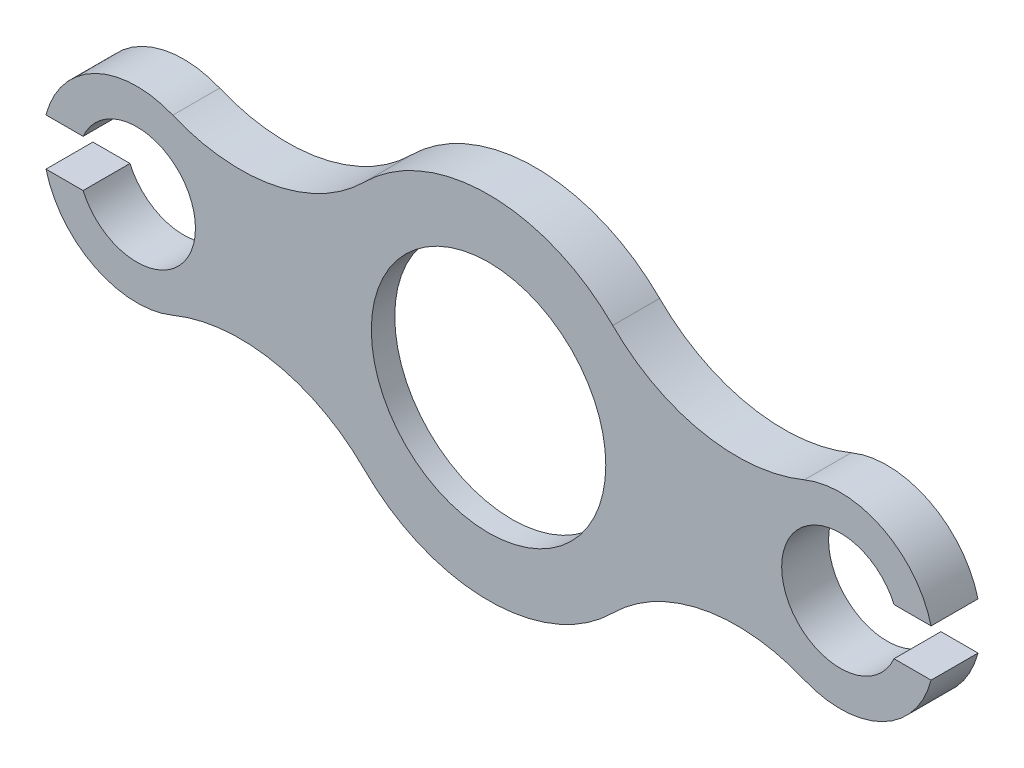
ISO-10303-21;
HEADER;
FILE_DESCRIPTION(('STEP AP214'),'2;1');
FILE_NAME('part.step','',(''),(''),'','','');
FILE_SCHEMA(('AUTOMOTIVE_DESIGN { 1 0 10303 214 1 1 1 1 }'));
ENDSEC;
DATA;
#1=APPLICATION_CONTEXT('core data for automotive mechanical design processes');
#2=APPLICATION_PROTOCOL_DEFINITION('international standard','automotive_design',2000,#1);
#3=PRODUCT_CONTEXT('',#1,'mechanical');
#4=PRODUCT('Part','Part','',(#3));
#5=PRODUCT_RELATED_PRODUCT_CATEGORY('part','',(#4));
#6=PRODUCT_DEFINITION_FORMATION('','',#4);
#7=PRODUCT_DEFINITION_CONTEXT('part definition',#1,'design');
#8=PRODUCT_DEFINITION('design','',#6,#7);
#9=PRODUCT_DEFINITION_SHAPE('','',#8);
#10=(LENGTH_UNIT() NAMED_UNIT(*) SI_UNIT(.MILLI.,.METRE.));
#11=(NAMED_UNIT(*) PLANE_ANGLE_UNIT() SI_UNIT($,.RADIAN.));
#12=(NAMED_UNIT(*) SI_UNIT($,.STERADIAN.) SOLID_ANGLE_UNIT());
#13=UNCERTAINTY_MEASURE_WITH_UNIT(LENGTH_MEASURE(1.E-05),#10,'distance_accuracy_value','');
#14=(GEOMETRIC_REPRESENTATION_CONTEXT(3) GLOBAL_UNCERTAINTY_ASSIGNED_CONTEXT((#13)) GLOBAL_UNIT_ASSIGNED_CONTEXT((#10,
#11,#12)) REPRESENTATION_CONTEXT('',''));
#15=CARTESIAN_POINT('',(0.,0.,0.));
#16=DIRECTION('',(0.,0.,1.));
#17=DIRECTION('',(1.,0.,0.));
#18=AXIS2_PLACEMENT_3D('',#15,#16,#17);
#19=CARTESIAN_POINT('',(-105.916666666667,-106.215157685814,20.));
#20=DIRECTION('',(0.,0.,-1.));
#21=DIRECTION('',(-1.,0.,0.));
#22=AXIS2_PLACEMENT_3D('',#19,#20,#21);
#23=CYLINDRICAL_SURFACE('',#22,75.);
#24=CARTESIAN_POINT('',(-105.916666666667,-106.215157685814,0.));
#25=DIRECTION('',(0.,0.,1.));
#26=DIRECTION('',(1.,0.,0.));
#27=AXIS2_PLACEMENT_3D('',#24,#25,#26);
#28=CIRCLE('',#27,75.);
#29=CARTESIAN_POINT('',(-52.9583333333333,-53.1075788429067,0.));
#30=VERTEX_POINT('',#29);
#31=CARTESIAN_POINT('',(-134.666666666667,-36.9444026733265,0.));
#32=VERTEX_POINT('',#31);
#33=EDGE_CURVE('E181',#30,#32,#28,.T.);
#34=ORIENTED_EDGE('',*,*,#33,.F.);
#35=DIRECTION('',(0.,0.,-1.));
#36=VECTOR('',#35,1.);
#37=CARTESIAN_POINT('',(-52.9583333333333,-53.1075788429067,20.));
#38=LINE('',#37,#36);
#39=CARTESIAN_POINT('',(-52.9583333333333,-53.1075788429067,20.));
#40=VERTEX_POINT('',#39);
#41=EDGE_CURVE('E11',#40,#30,#38,.T.);
#42=ORIENTED_EDGE('',*,*,#41,.F.);
#43=CARTESIAN_POINT('',(-105.916666666667,-106.215157685814,20.));
#44=DIRECTION('',(0.,0.,1.));
#45=DIRECTION('',(1.,0.,0.));
#46=AXIS2_PLACEMENT_3D('',#43,#44,#45);
#47=CIRCLE('',#46,75.);
#48=CARTESIAN_POINT('',(-134.666666666667,-36.9444026733265,20.));
#49=VERTEX_POINT('',#48);
#50=EDGE_CURVE('E318',#40,#49,#47,.T.);
#51=ORIENTED_EDGE('',*,*,#50,.T.);
#52=DIRECTION('',(0.,0.,-1.));
#53=VECTOR('',#52,1.);
#54=CARTESIAN_POINT('',(-134.666666666667,-36.9444026733265,20.));
#55=LINE('',#54,#53);
#56=EDGE_CURVE('E53',#49,#32,#55,.T.);
#57=ORIENTED_EDGE('',*,*,#56,.T.);
#58=EDGE_LOOP('',(#34,#42,#51,#57));
#59=FACE_BOUND('',#58,.T.);
#60=ADVANCED_FACE('F37',(#59),#23,.F.);
#61=CARTESIAN_POINT('',(0.,0.,20.));
#62=DIRECTION('',(0.,0.,-1.));
#63=DIRECTION('',(-1.,0.,0.));
#64=AXIS2_PLACEMENT_3D('',#61,#62,#63);
#65=CYLINDRICAL_SURFACE('',#64,75.);
#66=CARTESIAN_POINT('',(0.,0.,0.));
#67=DIRECTION('',(0.,0.,1.));
#68=DIRECTION('',(1.,0.,0.));
#69=AXIS2_PLACEMENT_3D('',#66,#67,#68);
#70=CIRCLE('',#69,75.);
#71=CARTESIAN_POINT('',(52.9583333333333,-53.1075788429067,0.));
#72=VERTEX_POINT('',#71);
#73=EDGE_CURVE('E183',#30,#72,#70,.T.);
#74=ORIENTED_EDGE('',*,*,#73,.T.);
#75=DIRECTION('',(0.,0.,-1.));
#76=VECTOR('',#75,1.);
#77=CARTESIAN_POINT('',(52.9583333333333,-53.1075788429067,20.));
#78=LINE('',#77,#76);
#79=CARTESIAN_POINT('',(52.9583333333333,-53.1075788429067,20.));
#80=VERTEX_POINT('',#79);
#81=EDGE_CURVE('E45',#80,#72,#78,.T.);
#82=ORIENTED_EDGE('',*,*,#81,.F.);
#83=CARTESIAN_POINT('',(0.,0.,20.));
#84=DIRECTION('',(0.,0.,1.));
#85=DIRECTION('',(1.,0.,0.));
#86=AXIS2_PLACEMENT_3D('',#83,#84,#85);
#87=CIRCLE('',#86,75.);
#88=EDGE_CURVE('E268',#40,#80,#87,.T.);
#89=ORIENTED_EDGE('',*,*,#88,.F.);
#90=ORIENTED_EDGE('',*,*,#41,.T.);
#91=EDGE_LOOP('',(#74,#82,#89,#90));
#92=FACE_BOUND('',#91,.T.);
#93=ADVANCED_FACE('F313',(#92),#65,.T.);
#94=CARTESIAN_POINT('',(105.916666666667,-106.215157685813,20.));
#95=DIRECTION('',(0.,0.,-1.));
#96=DIRECTION('',(-1.,0.,0.));
#97=AXIS2_PLACEMENT_3D('',#94,#95,#96);
#98=CYLINDRICAL_SURFACE('',#97,75.);
#99=CARTESIAN_POINT('',(105.916666666667,-106.215157685813,0.));
#100=DIRECTION('',(0.,0.,1.));
#101=DIRECTION('',(1.,0.,0.));
#102=AXIS2_PLACEMENT_3D('',#99,#100,#101);
#103=CIRCLE('',#102,75.);
#104=CARTESIAN_POINT('',(134.666666666667,-36.9444026733264,0.));
#105=VERTEX_POINT('',#104);
#106=EDGE_CURVE('E186',#72,#105,#103,.F.);
#107=ORIENTED_EDGE('',*,*,#106,.T.);
#108=DIRECTION('',(0.,0.,-1.));
#109=VECTOR('',#108,1.);
#110=CARTESIAN_POINT('',(134.666666666667,-36.9444026733264,20.));
#111=LINE('',#110,#109);
#112=CARTESIAN_POINT('',(134.666666666667,-36.9444026733264,20.));
#113=VERTEX_POINT('',#112);
#114=EDGE_CURVE('E240',#113,#105,#111,.T.);
#115=ORIENTED_EDGE('',*,*,#114,.F.);
#116=CARTESIAN_POINT('',(105.916666666667,-106.215157685813,20.));
#117=DIRECTION('',(0.,0.,1.));
#118=DIRECTION('',(1.,0.,0.));
#119=AXIS2_PLACEMENT_3D('',#116,#117,#118);
#120=CIRCLE('',#119,75.);
#121=EDGE_CURVE('E249',#80,#113,#120,.F.);
#122=ORIENTED_EDGE('',*,*,#121,.F.);
#123=ORIENTED_EDGE('',*,*,#81,.T.);
#124=EDGE_LOOP('',(#107,#115,#122,#123));
#125=FACE_BOUND('',#124,.T.);
#126=ADVANCED_FACE('F247',(#125),#98,.F.);
#127=CARTESIAN_POINT('',(150.,0.,20.));
#128=DIRECTION('',(0.,0.,-1.));
#129=DIRECTION('',(-1.,0.,0.));
#130=AXIS2_PLACEMENT_3D('',#127,#128,#129);
#131=CYLINDRICAL_SURFACE('',#130,40.);
#132=CARTESIAN_POINT('',(150.,0.,0.));
#133=DIRECTION('',(0.,0.,1.));
#134=DIRECTION('',(1.,0.,0.));
#135=AXIS2_PLACEMENT_3D('',#132,#133,#134);
#136=CIRCLE('',#135,40.);
#137=CARTESIAN_POINT('',(188.729833462074,-10.,0.));
#138=VERTEX_POINT('',#137);
#139=EDGE_CURVE('E188',#105,#138,#136,.T.);
#140=ORIENTED_EDGE('',*,*,#139,.T.);
#141=DIRECTION('',(0.,0.,-1.));
#142=VECTOR('',#141,1.);
#143=CARTESIAN_POINT('',(188.729833462074,-10.,20.));
#144=LINE('',#143,#142);
#145=CARTESIAN_POINT('',(188.729833462074,-10.,20.));
#146=VERTEX_POINT('',#145);
#147=EDGE_CURVE('E238',#146,#138,#144,.T.);
#148=ORIENTED_EDGE('',*,*,#147,.F.);
#149=CARTESIAN_POINT('',(150.,0.,20.));
#150=DIRECTION('',(0.,0.,1.));
#151=DIRECTION('',(1.,0.,0.));
#152=AXIS2_PLACEMENT_3D('',#149,#150,#151);
#153=CIRCLE('',#152,40.);
#154=EDGE_CURVE('E261',#113,#146,#153,.T.);
#155=ORIENTED_EDGE('',*,*,#154,.F.);
#156=ORIENTED_EDGE('',*,*,#114,.T.);
#157=EDGE_LOOP('',(#140,#148,#155,#156));
#158=FACE_BOUND('',#157,.T.);
#159=ADVANCED_FACE('F258',(#158),#131,.T.);
#160=CARTESIAN_POINT('',(0.,-10.,20.));
#161=DIRECTION('',(0.,1.,0.));
#162=DIRECTION('',(-1.,0.,0.));
#163=AXIS2_PLACEMENT_3D('',#160,#161,#162);
#164=PLANE('',#163);
#165=DIRECTION('',(1.,0.,0.));
#166=VECTOR('',#165,1.);
#167=CARTESIAN_POINT('',(0.,-10.,0.));
#168=LINE('',#167,#166);
#169=CARTESIAN_POINT('',(172.912878474779,-10.,0.));
#170=VERTEX_POINT('',#169);
#171=EDGE_CURVE('E191',#170,#138,#168,.T.);
#172=ORIENTED_EDGE('',*,*,#171,.F.);
#173=DIRECTION('',(0.,0.,-1.));
#174=VECTOR('',#173,1.);
#175=CARTESIAN_POINT('',(172.912878474779,-10.,20.));
#176=LINE('',#175,#174);
#177=CARTESIAN_POINT('',(172.912878474779,-10.,20.));
#178=VERTEX_POINT('',#177);
#179=EDGE_CURVE('E236',#178,#170,#176,.T.);
#180=ORIENTED_EDGE('',*,*,#179,.F.);
#181=DIRECTION('',(1.,0.,0.));
#182=VECTOR('',#181,1.);
#183=CARTESIAN_POINT('',(0.,-10.,20.));
#184=LINE('',#183,#182);
#185=EDGE_CURVE('E263',#178,#146,#184,.T.);
#186=ORIENTED_EDGE('',*,*,#185,.T.);
#187=ORIENTED_EDGE('',*,*,#147,.T.);
#188=EDGE_LOOP('',(#172,#180,#186,#187));
#189=FACE_BOUND('',#188,.T.);
#190=ADVANCED_FACE('F384',(#189),#164,.T.);
#191=CARTESIAN_POINT('',(150.,0.,20.));
#192=DIRECTION('',(0.,0.,-1.));
#193=DIRECTION('',(-1.,0.,0.));
#194=AXIS2_PLACEMENT_3D('',#191,#192,#193);
#195=CYLINDRICAL_SURFACE('',#194,25.);
#196=CARTESIAN_POINT('',(150.,0.,0.));
#197=DIRECTION('',(0.,0.,1.));
#198=DIRECTION('',(1.,0.,0.));
#199=AXIS2_PLACEMENT_3D('',#196,#197,#198);
#200=CIRCLE('',#199,25.);
#201=CARTESIAN_POINT('',(172.912878474779,10.,0.));
#202=VERTEX_POINT('',#201);
#203=EDGE_CURVE('E195',#202,#170,#200,.T.);
#204=ORIENTED_EDGE('',*,*,#203,.F.);
#205=DIRECTION('',(0.,0.,-1.));
#206=VECTOR('',#205,1.);
#207=CARTESIAN_POINT('',(172.912878474779,10.,20.));
#208=LINE('',#207,#206);
#209=CARTESIAN_POINT('',(172.912878474779,10.,20.));
#210=VERTEX_POINT('',#209);
#211=EDGE_CURVE('E234',#210,#202,#208,.T.);
#212=ORIENTED_EDGE('',*,*,#211,.F.);
#213=CARTESIAN_POINT('',(150.,0.,20.));
#214=DIRECTION('',(0.,0.,1.));
#215=DIRECTION('',(1.,0.,0.));
#216=AXIS2_PLACEMENT_3D('',#213,#214,#215);
#217=CIRCLE('',#216,25.);
#218=EDGE_CURVE('E266',#210,#178,#217,.T.);
#219=ORIENTED_EDGE('',*,*,#218,.T.);
#220=ORIENTED_EDGE('',*,*,#179,.T.);
#221=EDGE_LOOP('',(#204,#212,#219,#220));
#222=FACE_BOUND('',#221,.T.);
#223=ADVANCED_FACE('F379',(#222),#195,.F.);
#224=CARTESIAN_POINT('',(0.,10.,20.));
#225=DIRECTION('',(0.,-1.,0.));
#226=DIRECTION('',(1.,0.,0.));
#227=AXIS2_PLACEMENT_3D('',#224,#225,#226);
#228=PLANE('',#227);
#229=DIRECTION('',(-1.,0.,0.));
#230=VECTOR('',#229,1.);
#231=CARTESIAN_POINT('',(0.,10.,0.));
#232=LINE('',#231,#230);
#233=CARTESIAN_POINT('',(188.729833462074,10.,0.));
#234=VERTEX_POINT('',#233);
#235=EDGE_CURVE('E198',#234,#202,#232,.T.);
#236=ORIENTED_EDGE('',*,*,#235,.F.);
#237=DIRECTION('',(0.,0.,-1.));
#238=VECTOR('',#237,1.);
#239=CARTESIAN_POINT('',(188.729833462074,10.,20.));
#240=LINE('',#239,#238);
#241=CARTESIAN_POINT('',(188.729833462074,10.,20.));
#242=VERTEX_POINT('',#241);
#243=EDGE_CURVE('E232',#242,#234,#240,.T.);
#244=ORIENTED_EDGE('',*,*,#243,.F.);
#245=DIRECTION('',(-1.,0.,0.));
#246=VECTOR('',#245,1.);
#247=CARTESIAN_POINT('',(0.,10.,20.));
#248=LINE('',#247,#246);
#249=EDGE_CURVE('E271',#242,#210,#248,.T.);
#250=ORIENTED_EDGE('',*,*,#249,.T.);
#251=ORIENTED_EDGE('',*,*,#211,.T.);
#252=EDGE_LOOP('',(#236,#244,#250,#251));
#253=FACE_BOUND('',#252,.T.);
#254=ADVANCED_FACE('F383',(#253),#228,.T.);
#255=CARTESIAN_POINT('',(134.666666666667,36.9444026733264,0.));
#256=VERTEX_POINT('',#255);
#257=EDGE_CURVE('E192',#234,#256,#136,.T.);
#258=ORIENTED_EDGE('',*,*,#257,.T.);
#259=DIRECTION('',(0.,0.,-1.));
#260=VECTOR('',#259,1.);
#261=CARTESIAN_POINT('',(134.666666666667,36.9444026733264,20.));
#262=LINE('',#261,#260);
#263=CARTESIAN_POINT('',(134.666666666667,36.9444026733264,20.));
#264=VERTEX_POINT('',#263);
#265=EDGE_CURVE('E230',#264,#256,#262,.T.);
#266=ORIENTED_EDGE('',*,*,#265,.F.);
#267=EDGE_CURVE('E265',#242,#264,#153,.T.);
#268=ORIENTED_EDGE('',*,*,#267,.F.);
#269=ORIENTED_EDGE('',*,*,#243,.T.);
#270=EDGE_LOOP('',(#258,#266,#268,#269));
#271=FACE_BOUND('',#270,.T.);
#272=ADVANCED_FACE('F422',(#271),#131,.T.);
#273=CARTESIAN_POINT('',(105.916666666667,106.215157685813,20.));
#274=DIRECTION('',(0.,0.,-1.));
#275=DIRECTION('',(-1.,0.,0.));
#276=AXIS2_PLACEMENT_3D('',#273,#274,#275);
#277=CYLINDRICAL_SURFACE('',#276,75.);
#278=CARTESIAN_POINT('',(105.916666666667,106.215157685813,0.));
#279=DIRECTION('',(0.,0.,1.));
#280=DIRECTION('',(1.,0.,0.));
#281=AXIS2_PLACEMENT_3D('',#278,#279,#280);
#282=CIRCLE('',#281,75.);
#283=CARTESIAN_POINT('',(52.9583333333333,53.1075788429067,0.));
#284=VERTEX_POINT('',#283);
#285=EDGE_CURVE('E201',#284,#256,#282,.T.);
#286=ORIENTED_EDGE('',*,*,#285,.F.);
#287=DIRECTION('',(0.,0.,-1.));
#288=VECTOR('',#287,1.);
#289=CARTESIAN_POINT('',(52.9583333333333,53.1075788429067,20.));
#290=LINE('',#289,#288);
#291=CARTESIAN_POINT('',(52.9583333333333,53.1075788429067,20.));
#292=VERTEX_POINT('',#291);
#293=EDGE_CURVE('E228',#292,#284,#290,.T.);
#294=ORIENTED_EDGE('',*,*,#293,.F.);
#295=CARTESIAN_POINT('',(105.916666666667,106.215157685813,20.));
#296=DIRECTION('',(0.,0.,1.));
#297=DIRECTION('',(1.,0.,0.));
#298=AXIS2_PLACEMENT_3D('',#295,#296,#297);
#299=CIRCLE('',#298,75.);
#300=EDGE_CURVE('E270',#292,#264,#299,.T.);
#301=ORIENTED_EDGE('',*,*,#300,.T.);
#302=ORIENTED_EDGE('',*,*,#265,.T.);
#303=EDGE_LOOP('',(#286,#294,#301,#302));
#304=FACE_BOUND('',#303,.T.);
#305=ADVANCED_FACE('F446',(#304),#277,.F.);
#306=CARTESIAN_POINT('',(0.,0.,20.));
#307=DIRECTION('',(0.,0.,-1.));
#308=DIRECTION('',(-1.,0.,0.));
#309=AXIS2_PLACEMENT_3D('',#306,#307,#308);
#310=CYLINDRICAL_SURFACE('',#309,75.);
#311=CARTESIAN_POINT('',(0.,0.,0.));
#312=DIRECTION('',(0.,0.,1.));
#313=DIRECTION('',(1.,0.,0.));
#314=AXIS2_PLACEMENT_3D('',#311,#312,#313);
#315=CIRCLE('',#314,75.);
#316=CARTESIAN_POINT('',(-52.9583333333333,53.1075788429067,0.));
#317=VERTEX_POINT('',#316);
#318=EDGE_CURVE('E204',#284,#317,#315,.T.);
#319=ORIENTED_EDGE('',*,*,#318,.T.);
#320=DIRECTION('',(0.,0.,-1.));
#321=VECTOR('',#320,1.);
#322=CARTESIAN_POINT('',(-52.9583333333333,53.1075788429067,20.));
#323=LINE('',#322,#321);
#324=CARTESIAN_POINT('',(-52.9583333333333,53.1075788429067,20.));
#325=VERTEX_POINT('',#324);
#326=EDGE_CURVE('E225',#325,#317,#323,.T.);
#327=ORIENTED_EDGE('',*,*,#326,.F.);
#328=CARTESIAN_POINT('',(0.,0.,20.));
#329=DIRECTION('',(0.,0.,1.));
#330=DIRECTION('',(1.,0.,0.));
#331=AXIS2_PLACEMENT_3D('',#328,#329,#330);
#332=CIRCLE('',#331,75.);
#333=EDGE_CURVE('E277',#292,#325,#332,.T.);
#334=ORIENTED_EDGE('',*,*,#333,.F.);
#335=ORIENTED_EDGE('',*,*,#293,.T.);
#336=EDGE_LOOP('',(#319,#327,#334,#335));
#337=FACE_BOUND('',#336,.T.);
#338=ADVANCED_FACE('F454',(#337),#310,.T.);
#339=CARTESIAN_POINT('',(-105.916666666667,106.215157685813,20.));
#340=DIRECTION('',(0.,0.,-1.));
#341=DIRECTION('',(-1.,0.,0.));
#342=AXIS2_PLACEMENT_3D('',#339,#340,#341);
#343=CYLINDRICAL_SURFACE('',#342,75.);
#344=CARTESIAN_POINT('',(-105.916666666667,106.215157685813,0.));
#345=DIRECTION('',(0.,0.,1.));
#346=DIRECTION('',(1.,0.,0.));
#347=AXIS2_PLACEMENT_3D('',#344,#345,#346);
#348=CIRCLE('',#347,75.);
#349=CARTESIAN_POINT('',(-134.666666666667,36.9444026733264,0.));
#350=VERTEX_POINT('',#349);
#351=EDGE_CURVE('E206',#317,#350,#348,.F.);
#352=ORIENTED_EDGE('',*,*,#351,.T.);
#353=DIRECTION('',(0.,0.,-1.));
#354=VECTOR('',#353,1.);
#355=CARTESIAN_POINT('',(-134.666666666667,36.9444026733264,20.));
#356=LINE('',#355,#354);
#357=CARTESIAN_POINT('',(-134.666666666667,36.9444026733264,20.));
#358=VERTEX_POINT('',#357);
#359=EDGE_CURVE('E223',#358,#350,#356,.T.);
#360=ORIENTED_EDGE('',*,*,#359,.F.);
#361=CARTESIAN_POINT('',(-105.916666666667,106.215157685813,20.));
#362=DIRECTION('',(0.,0.,1.));
#363=DIRECTION('',(1.,0.,0.));
#364=AXIS2_PLACEMENT_3D('',#361,#362,#363);
#365=CIRCLE('',#364,75.);
#366=EDGE_CURVE('E286',#325,#358,#365,.F.);
#367=ORIENTED_EDGE('',*,*,#366,.F.);
#368=ORIENTED_EDGE('',*,*,#326,.T.);
#369=EDGE_LOOP('',(#352,#360,#367,#368));
#370=FACE_BOUND('',#369,.T.);
#371=ADVANCED_FACE('F296',(#370),#343,.F.);
#372=CARTESIAN_POINT('',(-150.,0.,20.));
#373=DIRECTION('',(0.,0.,-1.));
#374=DIRECTION('',(-1.,0.,0.));
#375=AXIS2_PLACEMENT_3D('',#372,#373,#374);
#376=CYLINDRICAL_SURFACE('',#375,40.);
#377=CARTESIAN_POINT('',(-150.,0.,0.));
#378=DIRECTION('',(0.,0.,1.));
#379=DIRECTION('',(1.,0.,0.));
#380=AXIS2_PLACEMENT_3D('',#377,#378,#379);
#381=CIRCLE('',#380,40.);
#382=CARTESIAN_POINT('',(-188.729833462074,10.,0.));
#383=VERTEX_POINT('',#382);
#384=EDGE_CURVE('E209',#383,#350,#381,.F.);
#385=ORIENTED_EDGE('',*,*,#384,.F.);
#386=DIRECTION('',(0.,0.,-1.));
#387=VECTOR('',#386,1.);
#388=CARTESIAN_POINT('',(-188.729833462074,10.,20.));
#389=LINE('',#388,#387);
#390=CARTESIAN_POINT('',(-188.729833462074,10.,20.));
#391=VERTEX_POINT('',#390);
#392=EDGE_CURVE('E221',#391,#383,#389,.T.);
#393=ORIENTED_EDGE('',*,*,#392,.F.);
#394=CARTESIAN_POINT('',(-150.,0.,20.));
#395=DIRECTION('',(0.,0.,1.));
#396=DIRECTION('',(1.,0.,0.));
#397=AXIS2_PLACEMENT_3D('',#394,#395,#396);
#398=CIRCLE('',#397,40.);
#399=EDGE_CURVE('E178',#391,#358,#398,.F.);
#400=ORIENTED_EDGE('',*,*,#399,.T.);
#401=ORIENTED_EDGE('',*,*,#359,.T.);
#402=EDGE_LOOP('',(#385,#393,#400,#401));
#403=FACE_BOUND('',#402,.T.);
#404=ADVANCED_FACE('F290',(#403),#376,.T.);
#405=CARTESIAN_POINT('',(0.,10.,20.));
#406=DIRECTION('',(0.,1.,0.));
#407=DIRECTION('',(-1.,0.,0.));
#408=AXIS2_PLACEMENT_3D('',#405,#406,#407);
#409=PLANE('',#408);
#410=DIRECTION('',(1.,0.,0.));
#411=VECTOR('',#410,1.);
#412=CARTESIAN_POINT('',(0.,10.,0.));
#413=LINE('',#412,#411);
#414=CARTESIAN_POINT('',(-172.912878474779,10.,0.));
#415=VERTEX_POINT('',#414);
#416=EDGE_CURVE('E212',#383,#415,#413,.T.);
#417=ORIENTED_EDGE('',*,*,#416,.T.);
#418=DIRECTION('',(0.,0.,-1.));
#419=VECTOR('',#418,1.);
#420=CARTESIAN_POINT('',(-172.912878474779,10.,20.));
#421=LINE('',#420,#419);
#422=CARTESIAN_POINT('',(-172.912878474779,10.,20.));
#423=VERTEX_POINT('',#422);
#424=EDGE_CURVE('E172',#423,#415,#421,.T.);
#425=ORIENTED_EDGE('',*,*,#424,.F.);
#426=DIRECTION('',(1.,0.,0.));
#427=VECTOR('',#426,1.);
#428=CARTESIAN_POINT('',(0.,10.,20.));
#429=LINE('',#428,#427);
#430=EDGE_CURVE('E160',#391,#423,#429,.T.);
#431=ORIENTED_EDGE('',*,*,#430,.F.);
#432=ORIENTED_EDGE('',*,*,#392,.T.);
#433=EDGE_LOOP('',(#417,#425,#431,#432));
#434=FACE_BOUND('',#433,.T.);
#435=ADVANCED_FACE('F301',(#434),#409,.F.);
#436=CARTESIAN_POINT('',(-150.,0.,20.));
#437=DIRECTION('',(0.,0.,-1.));
#438=DIRECTION('',(-1.,0.,0.));
#439=AXIS2_PLACEMENT_3D('',#436,#437,#438);
#440=CYLINDRICAL_SURFACE('',#439,25.);
#441=CARTESIAN_POINT('',(-150.,0.,0.));
#442=DIRECTION('',(0.,0.,1.));
#443=DIRECTION('',(1.,0.,0.));
#444=AXIS2_PLACEMENT_3D('',#441,#442,#443);
#445=CIRCLE('',#444,25.);
#446=CARTESIAN_POINT('',(-172.912878474779,-10.,0.));
#447=VERTEX_POINT('',#446);
#448=EDGE_CURVE('E169',#415,#447,#445,.F.);
#449=ORIENTED_EDGE('',*,*,#448,.T.);
#450=DIRECTION('',(0.,0.,-1.));
#451=VECTOR('',#450,1.);
#452=CARTESIAN_POINT('',(-172.912878474779,-10.,20.));
#453=LINE('',#452,#451);
#454=CARTESIAN_POINT('',(-172.912878474779,-10.,20.));
#455=VERTEX_POINT('',#454);
#456=EDGE_CURVE('E166',#455,#447,#453,.T.);
#457=ORIENTED_EDGE('',*,*,#456,.F.);
#458=CARTESIAN_POINT('',(-150.,0.,20.));
#459=DIRECTION('',(0.,0.,1.));
#460=DIRECTION('',(1.,0.,0.));
#461=AXIS2_PLACEMENT_3D('',#458,#459,#460);
#462=CIRCLE('',#461,25.);
#463=EDGE_CURVE('E151',#423,#455,#462,.F.);
#464=ORIENTED_EDGE('',*,*,#463,.F.);
#465=ORIENTED_EDGE('',*,*,#424,.T.);
#466=EDGE_LOOP('',(#449,#457,#464,#465));
#467=FACE_BOUND('',#466,.T.);
#468=ADVANCED_FACE('F167',(#467),#440,.F.);
#469=CARTESIAN_POINT('',(0.,-10.,20.));
#470=DIRECTION('',(0.,-1.,0.));
#471=DIRECTION('',(1.,0.,0.));
#472=AXIS2_PLACEMENT_3D('',#469,#470,#471);
#473=PLANE('',#472);
#474=DIRECTION('',(-1.,0.,0.));
#475=VECTOR('',#474,1.);
#476=CARTESIAN_POINT('',(0.,-10.,0.));
#477=LINE('',#476,#475);
#478=CARTESIAN_POINT('',(-188.729833462074,-10.,0.));
#479=VERTEX_POINT('',#478);
#480=EDGE_CURVE('E216',#447,#479,#477,.T.);
#481=ORIENTED_EDGE('',*,*,#480,.T.);
#482=DIRECTION('',(0.,0.,-1.));
#483=VECTOR('',#482,1.);
#484=CARTESIAN_POINT('',(-188.729833462074,-10.,20.));
#485=LINE('',#484,#483);
#486=CARTESIAN_POINT('',(-188.729833462074,-10.,20.));
#487=VERTEX_POINT('',#486);
#488=EDGE_CURVE('E103',#487,#479,#485,.T.);
#489=ORIENTED_EDGE('',*,*,#488,.F.);
#490=DIRECTION('',(-1.,0.,0.));
#491=VECTOR('',#490,1.);
#492=CARTESIAN_POINT('',(0.,-10.,20.));
#493=LINE('',#492,#491);
#494=EDGE_CURVE('E157',#455,#487,#493,.T.);
#495=ORIENTED_EDGE('',*,*,#494,.F.);
#496=ORIENTED_EDGE('',*,*,#456,.T.);
#497=EDGE_LOOP('',(#481,#489,#495,#496));
#498=FACE_BOUND('',#497,.T.);
#499=ADVANCED_FACE('F174',(#498),#473,.F.);
#500=EDGE_CURVE('E213',#32,#479,#381,.F.);
#501=ORIENTED_EDGE('',*,*,#500,.F.);
#502=ORIENTED_EDGE('',*,*,#56,.F.);
#503=EDGE_CURVE('E175',#49,#487,#398,.F.);
#504=ORIENTED_EDGE('',*,*,#503,.T.);
#505=ORIENTED_EDGE('',*,*,#488,.T.);
#506=EDGE_LOOP('',(#501,#502,#504,#505));
#507=FACE_BOUND('',#506,.T.);
#508=ADVANCED_FACE('F310',(#507),#376,.T.);
#509=CARTESIAN_POINT('',(0.,0.,20.));
#510=DIRECTION('',(0.,0.,1.));
#511=DIRECTION('',(1.,0.,0.));
#512=AXIS2_PLACEMENT_3D('',#509,#510,#511);
#513=PLANE('',#512);
#514=CARTESIAN_POINT('',(0.,0.,20.));
#515=DIRECTION('',(0.,0.,1.));
#516=DIRECTION('',(1.,0.,0.));
#517=AXIS2_PLACEMENT_3D('',#514,#515,#516);
#518=CIRCLE('',#517,50.);
#519=CARTESIAN_POINT('',(50.,0.,20.));
#520=VERTEX_POINT('',#519);
#521=EDGE_CURVE('E184',#520,#520,#518,.T.);
#522=ORIENTED_EDGE('',*,*,#521,.F.);
#523=EDGE_LOOP('',(#522));
#524=FACE_BOUND('',#523,.T.);
#525=ORIENTED_EDGE('',*,*,#50,.F.);
#526=ORIENTED_EDGE('',*,*,#88,.T.);
#527=ORIENTED_EDGE('',*,*,#121,.T.);
#528=ORIENTED_EDGE('',*,*,#154,.T.);
#529=ORIENTED_EDGE('',*,*,#185,.F.);
#530=ORIENTED_EDGE('',*,*,#218,.F.);
#531=ORIENTED_EDGE('',*,*,#249,.F.);
#532=ORIENTED_EDGE('',*,*,#267,.T.);
#533=ORIENTED_EDGE('',*,*,#300,.F.);
#534=ORIENTED_EDGE('',*,*,#333,.T.);
#535=ORIENTED_EDGE('',*,*,#366,.T.);
#536=ORIENTED_EDGE('',*,*,#399,.F.);
#537=ORIENTED_EDGE('',*,*,#430,.T.);
#538=ORIENTED_EDGE('',*,*,#463,.T.);
#539=ORIENTED_EDGE('',*,*,#494,.T.);
#540=ORIENTED_EDGE('',*,*,#503,.F.);
#541=EDGE_LOOP('',(#525,#526,#527,#528,#529,#530,#531,#532,#533,#534,#535,#536,#537,#538,#539,#540));
#542=FACE_BOUND('',#541,.T.);
#543=ADVANCED_FACE('F154',(#524,#542),#513,.T.);
#544=CARTESIAN_POINT('',(0.,0.,0.));
#545=DIRECTION('',(0.,0.,1.));
#546=DIRECTION('',(1.,0.,0.));
#547=AXIS2_PLACEMENT_3D('',#544,#545,#546);
#548=PLANE('',#547);
#549=CARTESIAN_POINT('',(0.,0.,0.));
#550=DIRECTION('',(0.,0.,-1.));
#551=DIRECTION('',(-1.,0.,0.));
#552=AXIS2_PLACEMENT_3D('',#549,#550,#551);
#553=CIRCLE('',#552,67.8);
#554=CARTESIAN_POINT('',(-67.8,0.,0.));
#555=VERTEX_POINT('',#554);
#556=EDGE_CURVE('E328',#555,#555,#553,.T.);
#557=ORIENTED_EDGE('',*,*,#556,.F.);
#558=EDGE_LOOP('',(#557));
#559=FACE_BOUND('',#558,.T.);
#560=ORIENTED_EDGE('',*,*,#33,.T.);
#561=ORIENTED_EDGE('',*,*,#500,.T.);
#562=ORIENTED_EDGE('',*,*,#480,.F.);
#563=ORIENTED_EDGE('',*,*,#448,.F.);
#564=ORIENTED_EDGE('',*,*,#416,.F.);
#565=ORIENTED_EDGE('',*,*,#384,.T.);
#566=ORIENTED_EDGE('',*,*,#351,.F.);
#567=ORIENTED_EDGE('',*,*,#318,.F.);
#568=ORIENTED_EDGE('',*,*,#285,.T.);
#569=ORIENTED_EDGE('',*,*,#257,.F.);
#570=ORIENTED_EDGE('',*,*,#235,.T.);
#571=ORIENTED_EDGE('',*,*,#203,.T.);
#572=ORIENTED_EDGE('',*,*,#171,.T.);
#573=ORIENTED_EDGE('',*,*,#139,.F.);
#574=ORIENTED_EDGE('',*,*,#106,.F.);
#575=ORIENTED_EDGE('',*,*,#73,.F.);
#576=EDGE_LOOP('',(#560,#561,#562,#563,#564,#565,#566,#567,#568,#569,#570,#571,#572,#573,#574,#575));
#577=FACE_BOUND('',#576,.T.);
#578=ADVANCED_FACE('F254',(#559,#577),#548,.F.);
#579=CARTESIAN_POINT('',(0.,0.,10.));
#580=DIRECTION('',(0.,0.,1.));
#581=DIRECTION('',(1.,0.,0.));
#582=AXIS2_PLACEMENT_3D('',#579,#580,#581);
#583=CYLINDRICAL_SURFACE('',#582,50.);
#584=CARTESIAN_POINT('',(0.,0.,10.));
#585=DIRECTION('',(0.,0.,1.));
#586=DIRECTION('',(1.,0.,0.));
#587=AXIS2_PLACEMENT_3D('',#584,#585,#586);
#588=CIRCLE('',#587,50.);
#589=CARTESIAN_POINT('',(50.,0.,10.));
#590=VERTEX_POINT('',#589);
#591=EDGE_CURVE('E324',#590,#590,#588,.T.);
#592=ORIENTED_EDGE('',*,*,#591,.F.);
#593=EDGE_LOOP('',(#592));
#594=FACE_BOUND('',#593,.T.);
#595=ORIENTED_EDGE('',*,*,#521,.T.);
#596=EDGE_LOOP('',(#595));
#597=FACE_BOUND('',#596,.T.);
#598=ADVANCED_FACE('F344',(#594,#597),#583,.F.);
#599=CARTESIAN_POINT('',(0.,0.,10.));
#600=DIRECTION('',(0.,0.,-1.));
#601=DIRECTION('',(-1.,0.,0.));
#602=AXIS2_PLACEMENT_3D('',#599,#600,#601);
#603=PLANE('',#602);
#604=CARTESIAN_POINT('',(0.,0.,10.));
#605=DIRECTION('',(0.,0.,-1.));
#606=DIRECTION('',(-1.,0.,0.));
#607=AXIS2_PLACEMENT_3D('',#604,#605,#606);
#608=CIRCLE('',#607,67.8);
#609=CARTESIAN_POINT('',(-67.8,0.,10.));
#610=VERTEX_POINT('',#609);
#611=EDGE_CURVE('E327',#610,#610,#608,.T.);
#612=ORIENTED_EDGE('',*,*,#611,.T.);
#613=EDGE_LOOP('',(#612));
#614=FACE_BOUND('',#613,.T.);
#615=ORIENTED_EDGE('',*,*,#591,.T.);
#616=EDGE_LOOP('',(#615));
#617=FACE_BOUND('',#616,.T.);
#618=ADVANCED_FACE('F334',(#614,#617),#603,.T.);
#619=CARTESIAN_POINT('',(0.,0.,10.));
#620=DIRECTION('',(0.,0.,-1.));
#621=DIRECTION('',(-1.,0.,0.));
#622=AXIS2_PLACEMENT_3D('',#619,#620,#621);
#623=CYLINDRICAL_SURFACE('',#622,67.8);
#624=ORIENTED_EDGE('',*,*,#611,.F.);
#625=EDGE_LOOP('',(#624));
#626=FACE_BOUND('',#625,.T.);
#627=ORIENTED_EDGE('',*,*,#556,.T.);
#628=EDGE_LOOP('',(#627));
#629=FACE_BOUND('',#628,.T.);
#630=ADVANCED_FACE('F337',(#626,#629),#623,.F.);
#631=CLOSED_SHELL('',(#60,#93,#126,#159,#190,#223,#254,#272,#305,#338,#371,#404,#435,#468,#499,
#508,#543,#578,#598,#618,#630));
#632=MANIFOLD_SOLID_BREP('B2',#631);
#633=ADVANCED_BREP_SHAPE_REPRESENTATION('',(#18,#632),#14);
#634=SHAPE_DEFINITION_REPRESENTATION(#9,#633);
ENDSEC;
END-ISO-10303-21;
